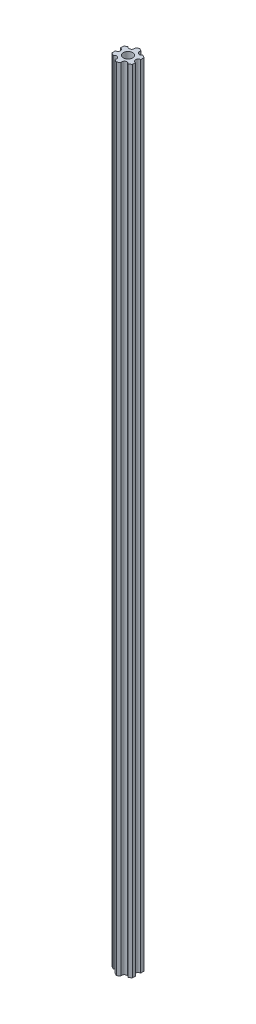
ISO-10303-21;
HEADER;
FILE_DESCRIPTION(('STEP AP214'),'2;1');
FILE_NAME('part.step','',(''),(''),'','','');
FILE_SCHEMA(('AUTOMOTIVE_DESIGN { 1 0 10303 214 1 1 1 1 }'));
ENDSEC;
DATA;
#1=APPLICATION_CONTEXT('core data for automotive mechanical design processes');
#2=APPLICATION_PROTOCOL_DEFINITION('international standard','automotive_design',2000,#1);
#3=PRODUCT_CONTEXT('',#1,'mechanical');
#4=PRODUCT('Part','Part','',(#3));
#5=PRODUCT_RELATED_PRODUCT_CATEGORY('part','',(#4));
#6=PRODUCT_DEFINITION_FORMATION('','',#4);
#7=PRODUCT_DEFINITION_CONTEXT('part definition',#1,'design');
#8=PRODUCT_DEFINITION('design','',#6,#7);
#9=PRODUCT_DEFINITION_SHAPE('','',#8);
#10=(LENGTH_UNIT() NAMED_UNIT(*) SI_UNIT(.MILLI.,.METRE.));
#11=(NAMED_UNIT(*) PLANE_ANGLE_UNIT() SI_UNIT($,.RADIAN.));
#12=(NAMED_UNIT(*) SI_UNIT($,.STERADIAN.) SOLID_ANGLE_UNIT());
#13=UNCERTAINTY_MEASURE_WITH_UNIT(LENGTH_MEASURE(1.E-05),#10,'distance_accuracy_value','');
#14=(GEOMETRIC_REPRESENTATION_CONTEXT(3) GLOBAL_UNCERTAINTY_ASSIGNED_CONTEXT((#13)) GLOBAL_UNIT_ASSIGNED_CONTEXT((#10,
#11,#12)) REPRESENTATION_CONTEXT('',''));
#15=CARTESIAN_POINT('',(0.,0.,0.));
#16=DIRECTION('',(0.,0.,1.));
#17=DIRECTION('',(1.,0.,0.));
#18=AXIS2_PLACEMENT_3D('',#15,#16,#17);
#19=CARTESIAN_POINT('',(3.175,-495.3,5.49926131403119));
#20=DIRECTION('',(0.,1.,0.));
#21=DIRECTION('',(-0.866025403784439,0.,0.5));
#22=AXIS2_PLACEMENT_3D('',#19,#20,#21);
#23=CYLINDRICAL_SURFACE('',#22,1.5875);
#24=DIRECTION('',(0.,-1.,0.));
#25=VECTOR('',#24,1.);
#26=CARTESIAN_POINT('',(1.8001846714922,-495.3,6.29301131403118));
#27=LINE('',#26,#25);
#28=CARTESIAN_POINT('',(1.8001846714922,0.,6.29301131403119));
#29=VERTEX_POINT('',#28);
#30=CARTESIAN_POINT('',(1.8001846714922,-495.3,6.29301131403119));
#31=VERTEX_POINT('',#30);
#32=EDGE_CURVE('E192',#29,#31,#27,.T.);
#33=ORIENTED_EDGE('',*,*,#32,.T.);
#34=CARTESIAN_POINT('',(3.175,-495.3,5.49926131403119));
#35=DIRECTION('',(0.,-1.,0.));
#36=DIRECTION('',(0.866025403784439,0.,-0.5));
#37=AXIS2_PLACEMENT_3D('',#34,#35,#36);
#38=CIRCLE('',#37,1.5875);
#39=CARTESIAN_POINT('',(4.5498153285078,-495.3,4.70551131403118));
#40=VERTEX_POINT('',#39);
#41=EDGE_CURVE('E238',#31,#40,#38,.T.);
#42=ORIENTED_EDGE('',*,*,#41,.T.);
#43=DIRECTION('',(0.,1.,0.));
#44=VECTOR('',#43,1.);
#45=CARTESIAN_POINT('',(4.5498153285078,-495.3,4.70551131403118));
#46=LINE('',#45,#44);
#47=CARTESIAN_POINT('',(4.5498153285078,0.,4.70551131403119));
#48=VERTEX_POINT('',#47);
#49=EDGE_CURVE('E194',#40,#48,#46,.T.);
#50=ORIENTED_EDGE('',*,*,#49,.T.);
#51=CARTESIAN_POINT('',(3.175,0.,5.49926131403119));
#52=DIRECTION('',(0.,-1.,0.));
#53=DIRECTION('',(0.866025403784439,0.,-0.5));
#54=AXIS2_PLACEMENT_3D('',#51,#52,#53);
#55=CIRCLE('',#54,1.5875);
#56=EDGE_CURVE('E189',#29,#48,#55,.T.);
#57=ORIENTED_EDGE('',*,*,#56,.F.);
#58=EDGE_LOOP('',(#33,#42,#50,#57));
#59=FACE_BOUND('',#58,.T.);
#60=ADVANCED_FACE('F17',(#59),#23,.F.);
#61=CARTESIAN_POINT('',(-3.175,-495.3,5.49926131403119));
#62=DIRECTION('',(0.,1.,0.));
#63=DIRECTION('',(-0.866025403784439,0.,-0.5));
#64=AXIS2_PLACEMENT_3D('',#61,#62,#63);
#65=CYLINDRICAL_SURFACE('',#64,1.5875);
#66=DIRECTION('',(0.,-1.,0.));
#67=VECTOR('',#66,1.);
#68=CARTESIAN_POINT('',(-4.5498153285078,-495.3,4.70551131403119));
#69=LINE('',#68,#67);
#70=CARTESIAN_POINT('',(-4.5498153285078,0.,4.70551131403119));
#71=VERTEX_POINT('',#70);
#72=CARTESIAN_POINT('',(-4.5498153285078,-495.3,4.70551131403119));
#73=VERTEX_POINT('',#72);
#74=EDGE_CURVE('E226',#71,#73,#69,.T.);
#75=ORIENTED_EDGE('',*,*,#74,.T.);
#76=CARTESIAN_POINT('',(-3.175,-495.3,5.49926131403119));
#77=DIRECTION('',(0.,-1.,0.));
#78=DIRECTION('',(0.866025403784439,0.,0.5));
#79=AXIS2_PLACEMENT_3D('',#76,#77,#78);
#80=CIRCLE('',#79,1.5875);
#81=CARTESIAN_POINT('',(-1.8001846714922,-495.3,6.29301131403119));
#82=VERTEX_POINT('',#81);
#83=EDGE_CURVE('E387',#73,#82,#80,.T.);
#84=ORIENTED_EDGE('',*,*,#83,.T.);
#85=DIRECTION('',(0.,1.,0.));
#86=VECTOR('',#85,1.);
#87=CARTESIAN_POINT('',(-1.8001846714922,-495.3,6.29301131403119));
#88=LINE('',#87,#86);
#89=CARTESIAN_POINT('',(-1.8001846714922,0.,6.29301131403119));
#90=VERTEX_POINT('',#89);
#91=EDGE_CURVE('E275',#82,#90,#88,.T.);
#92=ORIENTED_EDGE('',*,*,#91,.T.);
#93=CARTESIAN_POINT('',(-3.175,0.,5.49926131403119));
#94=DIRECTION('',(0.,-1.,0.));
#95=DIRECTION('',(0.866025403784439,0.,0.5));
#96=AXIS2_PLACEMENT_3D('',#93,#94,#95);
#97=CIRCLE('',#96,1.5875);
#98=EDGE_CURVE('E11',#71,#90,#97,.T.);
#99=ORIENTED_EDGE('',*,*,#98,.F.);
#100=EDGE_LOOP('',(#75,#84,#92,#99));
#101=FACE_BOUND('',#100,.T.);
#102=ADVANCED_FACE('F430',(#101),#65,.F.);
#103=CARTESIAN_POINT('',(-6.35,-495.3,0.));
#104=DIRECTION('',(0.,1.,0.));
#105=DIRECTION('',(0.,0.,-1.));
#106=AXIS2_PLACEMENT_3D('',#103,#104,#105);
#107=CYLINDRICAL_SURFACE('',#106,1.5875);
#108=DIRECTION('',(0.,-1.,0.));
#109=VECTOR('',#108,1.);
#110=CARTESIAN_POINT('',(-6.35,-495.3,-1.5875));
#111=LINE('',#110,#109);
#112=CARTESIAN_POINT('',(-6.35,0.,-1.5875));
#113=VERTEX_POINT('',#112);
#114=CARTESIAN_POINT('',(-6.35,-495.3,-1.5875));
#115=VERTEX_POINT('',#114);
#116=EDGE_CURVE('E230',#113,#115,#111,.T.);
#117=ORIENTED_EDGE('',*,*,#116,.T.);
#118=CARTESIAN_POINT('',(-6.35,-495.3,0.));
#119=DIRECTION('',(0.,-1.,0.));
#120=DIRECTION('',(0.,0.,1.));
#121=AXIS2_PLACEMENT_3D('',#118,#119,#120);
#122=CIRCLE('',#121,1.5875);
#123=CARTESIAN_POINT('',(-6.35,-495.3,1.5875));
#124=VERTEX_POINT('',#123);
#125=EDGE_CURVE('E390',#115,#124,#122,.T.);
#126=ORIENTED_EDGE('',*,*,#125,.T.);
#127=DIRECTION('',(0.,1.,0.));
#128=VECTOR('',#127,1.);
#129=CARTESIAN_POINT('',(-6.35,-495.3,1.5875));
#130=LINE('',#129,#128);
#131=CARTESIAN_POINT('',(-6.35,0.,1.5875));
#132=VERTEX_POINT('',#131);
#133=EDGE_CURVE('E304',#124,#132,#130,.T.);
#134=ORIENTED_EDGE('',*,*,#133,.T.);
#135=CARTESIAN_POINT('',(-6.35,0.,0.));
#136=DIRECTION('',(0.,-1.,0.));
#137=DIRECTION('',(0.,0.,1.));
#138=AXIS2_PLACEMENT_3D('',#135,#136,#137);
#139=CIRCLE('',#138,1.5875);
#140=EDGE_CURVE('E25',#113,#132,#139,.T.);
#141=ORIENTED_EDGE('',*,*,#140,.F.);
#142=EDGE_LOOP('',(#117,#126,#134,#141));
#143=FACE_BOUND('',#142,.T.);
#144=ADVANCED_FACE('F419',(#143),#107,.F.);
#145=CARTESIAN_POINT('',(-3.175,-495.3,-5.49926131403118));
#146=DIRECTION('',(0.,1.,0.));
#147=DIRECTION('',(0.866025403784439,0.,-0.5));
#148=AXIS2_PLACEMENT_3D('',#145,#146,#147);
#149=CYLINDRICAL_SURFACE('',#148,1.5875);
#150=DIRECTION('',(0.,-1.,0.));
#151=VECTOR('',#150,1.);
#152=CARTESIAN_POINT('',(-1.8001846714922,-495.3,-6.29301131403118));
#153=LINE('',#152,#151);
#154=CARTESIAN_POINT('',(-1.8001846714922,0.,-6.29301131403118));
#155=VERTEX_POINT('',#154);
#156=CARTESIAN_POINT('',(-1.8001846714922,-495.3,-6.29301131403118));
#157=VERTEX_POINT('',#156);
#158=EDGE_CURVE('E316',#155,#157,#153,.T.);
#159=ORIENTED_EDGE('',*,*,#158,.T.);
#160=CARTESIAN_POINT('',(-3.175,-495.3,-5.49926131403118));
#161=DIRECTION('',(0.,-1.,0.));
#162=DIRECTION('',(-0.866025403784439,0.,0.5));
#163=AXIS2_PLACEMENT_3D('',#160,#161,#162);
#164=CIRCLE('',#163,1.5875);
#165=CARTESIAN_POINT('',(-4.5498153285078,-495.3,-4.70551131403118));
#166=VERTEX_POINT('',#165);
#167=EDGE_CURVE('E253',#157,#166,#164,.T.);
#168=ORIENTED_EDGE('',*,*,#167,.T.);
#169=DIRECTION('',(0.,1.,0.));
#170=VECTOR('',#169,1.);
#171=CARTESIAN_POINT('',(-4.5498153285078,-495.3,-4.70551131403118));
#172=LINE('',#171,#170);
#173=CARTESIAN_POINT('',(-4.5498153285078,0.,-4.70551131403118));
#174=VERTEX_POINT('',#173);
#175=EDGE_CURVE('E334',#166,#174,#172,.T.);
#176=ORIENTED_EDGE('',*,*,#175,.T.);
#177=CARTESIAN_POINT('',(-3.175,0.,-5.49926131403118));
#178=DIRECTION('',(0.,-1.,0.));
#179=DIRECTION('',(-0.866025403784439,0.,0.5));
#180=AXIS2_PLACEMENT_3D('',#177,#178,#179);
#181=CIRCLE('',#180,1.5875);
#182=EDGE_CURVE('E221',#155,#174,#181,.T.);
#183=ORIENTED_EDGE('',*,*,#182,.F.);
#184=EDGE_LOOP('',(#159,#168,#176,#183));
#185=FACE_BOUND('',#184,.T.);
#186=ADVANCED_FACE('F409',(#185),#149,.F.);
#187=CARTESIAN_POINT('',(3.175,-495.3,-5.49926131403119));
#188=DIRECTION('',(0.,1.,0.));
#189=DIRECTION('',(0.866025403784439,0.,0.5));
#190=AXIS2_PLACEMENT_3D('',#187,#188,#189);
#191=CYLINDRICAL_SURFACE('',#190,1.5875);
#192=DIRECTION('',(0.,-1.,0.));
#193=VECTOR('',#192,1.);
#194=CARTESIAN_POINT('',(4.5498153285078,-495.3,-4.70551131403119));
#195=LINE('',#194,#193);
#196=CARTESIAN_POINT('',(4.5498153285078,0.,-4.70551131403119));
#197=VERTEX_POINT('',#196);
#198=CARTESIAN_POINT('',(4.5498153285078,-495.3,-4.70551131403119));
#199=VERTEX_POINT('',#198);
#200=EDGE_CURVE('E346',#197,#199,#195,.T.);
#201=ORIENTED_EDGE('',*,*,#200,.T.);
#202=CARTESIAN_POINT('',(3.175,-495.3,-5.49926131403119));
#203=DIRECTION('',(0.,-1.,0.));
#204=DIRECTION('',(-0.866025403784439,0.,-0.5));
#205=AXIS2_PLACEMENT_3D('',#202,#203,#204);
#206=CIRCLE('',#205,1.5875);
#207=CARTESIAN_POINT('',(1.8001846714922,-495.3,-6.29301131403119));
#208=VERTEX_POINT('',#207);
#209=EDGE_CURVE('E249',#199,#208,#206,.T.);
#210=ORIENTED_EDGE('',*,*,#209,.T.);
#211=DIRECTION('',(0.,1.,0.));
#212=VECTOR('',#211,1.);
#213=CARTESIAN_POINT('',(1.8001846714922,-495.3,-6.29301131403119));
#214=LINE('',#213,#212);
#215=CARTESIAN_POINT('',(1.8001846714922,0.,-6.29301131403119));
#216=VERTEX_POINT('',#215);
#217=EDGE_CURVE('E290',#208,#216,#214,.T.);
#218=ORIENTED_EDGE('',*,*,#217,.T.);
#219=CARTESIAN_POINT('',(3.175,0.,-5.49926131403119));
#220=DIRECTION('',(0.,-1.,0.));
#221=DIRECTION('',(-0.866025403784439,0.,-0.5));
#222=AXIS2_PLACEMENT_3D('',#219,#220,#221);
#223=CIRCLE('',#222,1.5875);
#224=EDGE_CURVE('E294',#197,#216,#223,.T.);
#225=ORIENTED_EDGE('',*,*,#224,.F.);
#226=EDGE_LOOP('',(#201,#210,#218,#225));
#227=FACE_BOUND('',#226,.T.);
#228=ADVANCED_FACE('F455',(#227),#191,.F.);
#229=CARTESIAN_POINT('',(6.35,-495.3,0.));
#230=DIRECTION('',(0.,1.,0.));
#231=DIRECTION('',(0.,0.,1.));
#232=AXIS2_PLACEMENT_3D('',#229,#230,#231);
#233=CYLINDRICAL_SURFACE('',#232,1.5875);
#234=DIRECTION('',(0.,-1.,0.));
#235=VECTOR('',#234,1.);
#236=CARTESIAN_POINT('',(6.35,-495.3,1.5875));
#237=LINE('',#236,#235);
#238=CARTESIAN_POINT('',(6.35,0.,1.5875));
#239=VERTEX_POINT('',#238);
#240=CARTESIAN_POINT('',(6.35,-495.3,1.5875));
#241=VERTEX_POINT('',#240);
#242=EDGE_CURVE('E258',#239,#241,#237,.T.);
#243=ORIENTED_EDGE('',*,*,#242,.T.);
#244=CARTESIAN_POINT('',(6.35,-495.3,0.));
#245=DIRECTION('',(0.,-1.,0.));
#246=DIRECTION('',(0.,0.,-1.));
#247=AXIS2_PLACEMENT_3D('',#244,#245,#246);
#248=CIRCLE('',#247,1.5875);
#249=CARTESIAN_POINT('',(6.35,-495.3,-1.5875));
#250=VERTEX_POINT('',#249);
#251=EDGE_CURVE('E252',#241,#250,#248,.T.);
#252=ORIENTED_EDGE('',*,*,#251,.T.);
#253=DIRECTION('',(0.,1.,0.));
#254=VECTOR('',#253,1.);
#255=CARTESIAN_POINT('',(6.35,-495.3,-1.5875));
#256=LINE('',#255,#254);
#257=CARTESIAN_POINT('',(6.35,0.,-1.5875));
#258=VERTEX_POINT('',#257);
#259=EDGE_CURVE('E355',#250,#258,#256,.T.);
#260=ORIENTED_EDGE('',*,*,#259,.T.);
#261=CARTESIAN_POINT('',(6.35,0.,0.));
#262=DIRECTION('',(0.,-1.,0.));
#263=DIRECTION('',(0.,0.,-1.));
#264=AXIS2_PLACEMENT_3D('',#261,#262,#263);
#265=CIRCLE('',#264,1.5875);
#266=EDGE_CURVE('E199',#239,#258,#265,.T.);
#267=ORIENTED_EDGE('',*,*,#266,.F.);
#268=EDGE_LOOP('',(#243,#252,#260,#267));
#269=FACE_BOUND('',#268,.T.);
#270=ADVANCED_FACE('F444',(#269),#233,.F.);
#271=CARTESIAN_POINT('',(0.,-495.3,0.));
#272=DIRECTION('',(0.,1.,0.));
#273=DIRECTION('',(0.,0.,1.));
#274=AXIS2_PLACEMENT_3D('',#271,#272,#273);
#275=CYLINDRICAL_SURFACE('',#274,2.9337);
#276=CARTESIAN_POINT('',(0.,0.,0.));
#277=DIRECTION('',(0.,-1.,0.));
#278=DIRECTION('',(0.,0.,-1.));
#279=AXIS2_PLACEMENT_3D('',#276,#277,#278);
#280=CIRCLE('',#279,2.9337);
#281=CARTESIAN_POINT('',(0.,0.,-2.9337));
#282=VERTEX_POINT('',#281);
#283=EDGE_CURVE('E35',#282,#282,#280,.T.);
#284=ORIENTED_EDGE('',*,*,#283,.F.);
#285=EDGE_LOOP('',(#284));
#286=FACE_BOUND('',#285,.T.);
#287=CARTESIAN_POINT('',(0.,-495.3,0.));
#288=DIRECTION('',(0.,-1.,0.));
#289=DIRECTION('',(0.,0.,-1.));
#290=AXIS2_PLACEMENT_3D('',#287,#288,#289);
#291=CIRCLE('',#290,2.9337);
#292=CARTESIAN_POINT('',(0.,-495.3,-2.9337));
#293=VERTEX_POINT('',#292);
#294=EDGE_CURVE('E42',#293,#293,#291,.T.);
#295=ORIENTED_EDGE('',*,*,#294,.T.);
#296=EDGE_LOOP('',(#295));
#297=FACE_BOUND('',#296,.T.);
#298=ADVANCED_FACE('F488',(#286,#297),#275,.F.);
#299=CARTESIAN_POINT('',(0.,0.,0.));
#300=DIRECTION('',(0.,-1.,0.));
#301=DIRECTION('',(0.,0.,-1.));
#302=AXIS2_PLACEMENT_3D('',#299,#300,#301);
#303=PLANE('',#302);
#304=DIRECTION('',(-0.866025403784439,0.,0.5));
#305=VECTOR('',#304,1.);
#306=CARTESIAN_POINT('',(3.175,0.,5.49926131403118));
#307=LINE('',#306,#305);
#308=CARTESIAN_POINT('',(0.,0.,7.33234841870825));
#309=VERTEX_POINT('',#308);
#310=EDGE_CURVE('E202',#29,#309,#307,.T.);
#311=ORIENTED_EDGE('',*,*,#310,.F.);
#312=ORIENTED_EDGE('',*,*,#56,.T.);
#313=DIRECTION('',(-0.866025403784439,0.,0.5));
#314=VECTOR('',#313,1.);
#315=CARTESIAN_POINT('',(3.175,0.,5.49926131403118));
#316=LINE('',#315,#314);
#317=CARTESIAN_POINT('',(6.35,0.,3.66617420935412));
#318=VERTEX_POINT('',#317);
#319=EDGE_CURVE('E223',#318,#48,#316,.T.);
#320=ORIENTED_EDGE('',*,*,#319,.F.);
#321=DIRECTION('',(0.,0.,1.));
#322=VECTOR('',#321,1.);
#323=CARTESIAN_POINT('',(6.35,0.,0.));
#324=LINE('',#323,#322);
#325=EDGE_CURVE('E377',#239,#318,#324,.T.);
#326=ORIENTED_EDGE('',*,*,#325,.F.);
#327=ORIENTED_EDGE('',*,*,#266,.T.);
#328=DIRECTION('',(0.,0.,1.));
#329=VECTOR('',#328,1.);
#330=CARTESIAN_POINT('',(6.35,0.,0.));
#331=LINE('',#330,#329);
#332=CARTESIAN_POINT('',(6.35,0.,-3.66617420935413));
#333=VERTEX_POINT('',#332);
#334=EDGE_CURVE('E239',#333,#258,#331,.T.);
#335=ORIENTED_EDGE('',*,*,#334,.F.);
#336=DIRECTION('',(0.866025403784439,0.,0.5));
#337=VECTOR('',#336,1.);
#338=CARTESIAN_POINT('',(3.175,0.,-5.49926131403119));
#339=LINE('',#338,#337);
#340=EDGE_CURVE('E350',#197,#333,#339,.T.);
#341=ORIENTED_EDGE('',*,*,#340,.F.);
#342=ORIENTED_EDGE('',*,*,#224,.T.);
#343=DIRECTION('',(0.866025403784439,0.,0.5));
#344=VECTOR('',#343,1.);
#345=CARTESIAN_POINT('',(3.175,0.,-5.49926131403119));
#346=LINE('',#345,#344);
#347=CARTESIAN_POINT('',(0.,0.,-7.33234841870825));
#348=VERTEX_POINT('',#347);
#349=EDGE_CURVE('E254',#348,#216,#346,.T.);
#350=ORIENTED_EDGE('',*,*,#349,.F.);
#351=DIRECTION('',(0.866025403784439,0.,-0.5));
#352=VECTOR('',#351,1.);
#353=CARTESIAN_POINT('',(-3.175,0.,-5.49926131403119));
#354=LINE('',#353,#352);
#355=EDGE_CURVE('E320',#155,#348,#354,.T.);
#356=ORIENTED_EDGE('',*,*,#355,.F.);
#357=ORIENTED_EDGE('',*,*,#182,.T.);
#358=DIRECTION('',(0.866025403784439,0.,-0.5));
#359=VECTOR('',#358,1.);
#360=CARTESIAN_POINT('',(-3.175,0.,-5.49926131403119));
#361=LINE('',#360,#359);
#362=CARTESIAN_POINT('',(-6.35,0.,-3.66617420935412));
#363=VERTEX_POINT('',#362);
#364=EDGE_CURVE('E342',#363,#174,#361,.T.);
#365=ORIENTED_EDGE('',*,*,#364,.F.);
#366=DIRECTION('',(0.,0.,-1.));
#367=VECTOR('',#366,1.);
#368=CARTESIAN_POINT('',(-6.35,0.,0.));
#369=LINE('',#368,#367);
#370=EDGE_CURVE('E276',#113,#363,#369,.T.);
#371=ORIENTED_EDGE('',*,*,#370,.F.);
#372=ORIENTED_EDGE('',*,*,#140,.T.);
#373=DIRECTION('',(0.,0.,-1.));
#374=VECTOR('',#373,1.);
#375=CARTESIAN_POINT('',(-6.35,0.,0.));
#376=LINE('',#375,#374);
#377=CARTESIAN_POINT('',(-6.35,0.,3.66617420935413));
#378=VERTEX_POINT('',#377);
#379=EDGE_CURVE('E312',#378,#132,#376,.T.);
#380=ORIENTED_EDGE('',*,*,#379,.F.);
#381=DIRECTION('',(-0.866025403784439,0.,-0.5));
#382=VECTOR('',#381,1.);
#383=CARTESIAN_POINT('',(-3.175,0.,5.49926131403119));
#384=LINE('',#383,#382);
#385=EDGE_CURVE('E265',#71,#378,#384,.T.);
#386=ORIENTED_EDGE('',*,*,#385,.F.);
#387=ORIENTED_EDGE('',*,*,#98,.T.);
#388=DIRECTION('',(-0.866025403784439,0.,-0.5));
#389=VECTOR('',#388,1.);
#390=CARTESIAN_POINT('',(-3.175,0.,5.49926131403119));
#391=LINE('',#390,#389);
#392=EDGE_CURVE('E205',#309,#90,#391,.T.);
#393=ORIENTED_EDGE('',*,*,#392,.F.);
#394=EDGE_LOOP('',(#311,#312,#320,#326,#327,#335,#341,#342,#350,#356,#357,#365,#371,#372,#380,
#386,#387,#393));
#395=FACE_BOUND('',#394,.T.);
#396=ORIENTED_EDGE('',*,*,#283,.T.);
#397=EDGE_LOOP('',(#396));
#398=FACE_BOUND('',#397,.T.);
#399=ADVANCED_FACE('F203',(#395,#398),#303,.F.);
#400=CARTESIAN_POINT('',(0.,-495.3,0.));
#401=DIRECTION('',(0.,-1.,0.));
#402=DIRECTION('',(0.,0.,-1.));
#403=AXIS2_PLACEMENT_3D('',#400,#401,#402);
#404=PLANE('',#403);
#405=ORIENTED_EDGE('',*,*,#41,.F.);
#406=DIRECTION('',(-0.866025403784439,0.,0.5));
#407=VECTOR('',#406,1.);
#408=CARTESIAN_POINT('',(3.175,-495.3,5.49926131403118));
#409=LINE('',#408,#407);
#410=CARTESIAN_POINT('',(0.,-495.3,7.33234841870825));
#411=VERTEX_POINT('',#410);
#412=EDGE_CURVE('E215',#31,#411,#409,.T.);
#413=ORIENTED_EDGE('',*,*,#412,.T.);
#414=DIRECTION('',(-0.866025403784439,0.,-0.5));
#415=VECTOR('',#414,1.);
#416=CARTESIAN_POINT('',(-3.175,-495.3,5.49926131403119));
#417=LINE('',#416,#415);
#418=EDGE_CURVE('E231',#411,#82,#417,.T.);
#419=ORIENTED_EDGE('',*,*,#418,.T.);
#420=ORIENTED_EDGE('',*,*,#83,.F.);
#421=DIRECTION('',(-0.866025403784439,0.,-0.5));
#422=VECTOR('',#421,1.);
#423=CARTESIAN_POINT('',(-3.175,-495.3,5.49926131403119));
#424=LINE('',#423,#422);
#425=CARTESIAN_POINT('',(-6.35,-495.3,3.66617420935413));
#426=VERTEX_POINT('',#425);
#427=EDGE_CURVE('E264',#73,#426,#424,.T.);
#428=ORIENTED_EDGE('',*,*,#427,.T.);
#429=DIRECTION('',(0.,0.,-1.));
#430=VECTOR('',#429,1.);
#431=CARTESIAN_POINT('',(-6.35,-495.3,0.));
#432=LINE('',#431,#430);
#433=EDGE_CURVE('E308',#426,#124,#432,.T.);
#434=ORIENTED_EDGE('',*,*,#433,.T.);
#435=ORIENTED_EDGE('',*,*,#125,.F.);
#436=DIRECTION('',(0.,0.,-1.));
#437=VECTOR('',#436,1.);
#438=CARTESIAN_POINT('',(-6.35,-495.3,0.));
#439=LINE('',#438,#437);
#440=CARTESIAN_POINT('',(-6.35,-495.3,-3.66617420935412));
#441=VERTEX_POINT('',#440);
#442=EDGE_CURVE('E300',#115,#441,#439,.T.);
#443=ORIENTED_EDGE('',*,*,#442,.T.);
#444=DIRECTION('',(0.866025403784439,0.,-0.5));
#445=VECTOR('',#444,1.);
#446=CARTESIAN_POINT('',(-3.175,-495.3,-5.49926131403119));
#447=LINE('',#446,#445);
#448=EDGE_CURVE('E338',#441,#166,#447,.T.);
#449=ORIENTED_EDGE('',*,*,#448,.T.);
#450=ORIENTED_EDGE('',*,*,#167,.F.);
#451=DIRECTION('',(0.866025403784439,0.,-0.5));
#452=VECTOR('',#451,1.);
#453=CARTESIAN_POINT('',(-3.175,-495.3,-5.49926131403119));
#454=LINE('',#453,#452);
#455=CARTESIAN_POINT('',(0.,-495.3,-7.33234841870825));
#456=VERTEX_POINT('',#455);
#457=EDGE_CURVE('E330',#157,#456,#454,.T.);
#458=ORIENTED_EDGE('',*,*,#457,.T.);
#459=DIRECTION('',(0.866025403784439,0.,0.5));
#460=VECTOR('',#459,1.);
#461=CARTESIAN_POINT('',(3.175,-495.3,-5.49926131403119));
#462=LINE('',#461,#460);
#463=EDGE_CURVE('E259',#456,#208,#462,.T.);
#464=ORIENTED_EDGE('',*,*,#463,.T.);
#465=ORIENTED_EDGE('',*,*,#209,.F.);
#466=DIRECTION('',(0.866025403784439,0.,0.5));
#467=VECTOR('',#466,1.);
#468=CARTESIAN_POINT('',(3.175,-495.3,-5.49926131403119));
#469=LINE('',#468,#467);
#470=CARTESIAN_POINT('',(6.35,-495.3,-3.66617420935413));
#471=VERTEX_POINT('',#470);
#472=EDGE_CURVE('E364',#199,#471,#469,.T.);
#473=ORIENTED_EDGE('',*,*,#472,.T.);
#474=DIRECTION('',(0.,0.,1.));
#475=VECTOR('',#474,1.);
#476=CARTESIAN_POINT('',(6.35,-495.3,0.));
#477=LINE('',#476,#475);
#478=EDGE_CURVE('E359',#471,#250,#477,.T.);
#479=ORIENTED_EDGE('',*,*,#478,.T.);
#480=ORIENTED_EDGE('',*,*,#251,.F.);
#481=DIRECTION('',(0.,0.,1.));
#482=VECTOR('',#481,1.);
#483=CARTESIAN_POINT('',(6.35,-495.3,0.));
#484=LINE('',#483,#482);
#485=CARTESIAN_POINT('',(6.35,-495.3,3.66617420935412));
#486=VERTEX_POINT('',#485);
#487=EDGE_CURVE('E360',#241,#486,#484,.T.);
#488=ORIENTED_EDGE('',*,*,#487,.T.);
#489=DIRECTION('',(-0.866025403784439,0.,0.5));
#490=VECTOR('',#489,1.);
#491=CARTESIAN_POINT('',(3.175,-495.3,5.49926131403118));
#492=LINE('',#491,#490);
#493=EDGE_CURVE('E242',#486,#40,#492,.T.);
#494=ORIENTED_EDGE('',*,*,#493,.T.);
#495=EDGE_LOOP('',(#405,#413,#419,#420,#428,#434,#435,#443,#449,#450,#458,#464,#465,#473,#479,
#480,#488,#494));
#496=FACE_BOUND('',#495,.T.);
#497=ORIENTED_EDGE('',*,*,#294,.F.);
#498=EDGE_LOOP('',(#497));
#499=FACE_BOUND('',#498,.T.);
#500=ADVANCED_FACE('F412',(#496,#499),#404,.T.);
#501=CARTESIAN_POINT('',(6.35,-495.3,0.));
#502=DIRECTION('',(-1.,0.,0.));
#503=DIRECTION('',(0.,1.,0.));
#504=AXIS2_PLACEMENT_3D('',#501,#502,#503);
#505=PLANE('',#504);
#506=ORIENTED_EDGE('',*,*,#259,.F.);
#507=ORIENTED_EDGE('',*,*,#478,.F.);
#508=DIRECTION('',(0.,1.,0.));
#509=VECTOR('',#508,1.);
#510=CARTESIAN_POINT('',(6.35,-495.3,-3.66617420935413));
#511=LINE('',#510,#509);
#512=EDGE_CURVE('E354',#471,#333,#511,.T.);
#513=ORIENTED_EDGE('',*,*,#512,.T.);
#514=ORIENTED_EDGE('',*,*,#334,.T.);
#515=EDGE_LOOP('',(#506,#507,#513,#514));
#516=FACE_BOUND('',#515,.T.);
#517=ADVANCED_FACE('F447',(#516),#505,.F.);
#518=CARTESIAN_POINT('',(6.35,-495.3,0.));
#519=DIRECTION('',(-1.,0.,0.));
#520=DIRECTION('',(0.,1.,0.));
#521=AXIS2_PLACEMENT_3D('',#518,#519,#520);
#522=PLANE('',#521);
#523=ORIENTED_EDGE('',*,*,#242,.F.);
#524=ORIENTED_EDGE('',*,*,#325,.T.);
#525=DIRECTION('',(0.,1.,0.));
#526=VECTOR('',#525,1.);
#527=CARTESIAN_POINT('',(6.35,-495.3,3.66617420935412));
#528=LINE('',#527,#526);
#529=EDGE_CURVE('E227',#486,#318,#528,.T.);
#530=ORIENTED_EDGE('',*,*,#529,.F.);
#531=ORIENTED_EDGE('',*,*,#487,.F.);
#532=EDGE_LOOP('',(#523,#524,#530,#531));
#533=FACE_BOUND('',#532,.T.);
#534=ADVANCED_FACE('F442',(#533),#522,.F.);
#535=CARTESIAN_POINT('',(3.175,-495.3,-5.49926131403119));
#536=DIRECTION('',(-0.5,0.,0.866025403784439));
#537=DIRECTION('',(0.,1.,0.));
#538=AXIS2_PLACEMENT_3D('',#535,#536,#537);
#539=PLANE('',#538);
#540=ORIENTED_EDGE('',*,*,#217,.F.);
#541=ORIENTED_EDGE('',*,*,#463,.F.);
#542=DIRECTION('',(0.,1.,0.));
#543=VECTOR('',#542,1.);
#544=CARTESIAN_POINT('',(0.,-495.3,-7.33234841870825));
#545=LINE('',#544,#543);
#546=EDGE_CURVE('E326',#456,#348,#545,.T.);
#547=ORIENTED_EDGE('',*,*,#546,.T.);
#548=ORIENTED_EDGE('',*,*,#349,.T.);
#549=EDGE_LOOP('',(#540,#541,#547,#548));
#550=FACE_BOUND('',#549,.T.);
#551=ADVANCED_FACE('F458',(#550),#539,.F.);
#552=CARTESIAN_POINT('',(3.175,-495.3,-5.49926131403119));
#553=DIRECTION('',(-0.5,0.,0.866025403784439));
#554=DIRECTION('',(0.,1.,0.));
#555=AXIS2_PLACEMENT_3D('',#552,#553,#554);
#556=PLANE('',#555);
#557=ORIENTED_EDGE('',*,*,#200,.F.);
#558=ORIENTED_EDGE('',*,*,#340,.T.);
#559=ORIENTED_EDGE('',*,*,#512,.F.);
#560=ORIENTED_EDGE('',*,*,#472,.F.);
#561=EDGE_LOOP('',(#557,#558,#559,#560));
#562=FACE_BOUND('',#561,.T.);
#563=ADVANCED_FACE('F453',(#562),#556,.F.);
#564=CARTESIAN_POINT('',(-3.175,-495.3,-5.49926131403119));
#565=DIRECTION('',(0.5,0.,0.866025403784439));
#566=DIRECTION('',(0.,-1.,0.));
#567=AXIS2_PLACEMENT_3D('',#564,#565,#566);
#568=PLANE('',#567);
#569=ORIENTED_EDGE('',*,*,#175,.F.);
#570=ORIENTED_EDGE('',*,*,#448,.F.);
#571=DIRECTION('',(0.,1.,0.));
#572=VECTOR('',#571,1.);
#573=CARTESIAN_POINT('',(-6.35,-495.3,-3.66617420935412));
#574=LINE('',#573,#572);
#575=EDGE_CURVE('E280',#441,#363,#574,.T.);
#576=ORIENTED_EDGE('',*,*,#575,.T.);
#577=ORIENTED_EDGE('',*,*,#364,.T.);
#578=EDGE_LOOP('',(#569,#570,#576,#577));
#579=FACE_BOUND('',#578,.T.);
#580=ADVANCED_FACE('F407',(#579),#568,.F.);
#581=CARTESIAN_POINT('',(-3.175,-495.3,-5.49926131403119));
#582=DIRECTION('',(0.5,0.,0.866025403784439));
#583=DIRECTION('',(0.,-1.,0.));
#584=AXIS2_PLACEMENT_3D('',#581,#582,#583);
#585=PLANE('',#584);
#586=ORIENTED_EDGE('',*,*,#158,.F.);
#587=ORIENTED_EDGE('',*,*,#355,.T.);
#588=ORIENTED_EDGE('',*,*,#546,.F.);
#589=ORIENTED_EDGE('',*,*,#457,.F.);
#590=EDGE_LOOP('',(#586,#587,#588,#589));
#591=FACE_BOUND('',#590,.T.);
#592=ADVANCED_FACE('F461',(#591),#585,.F.);
#593=CARTESIAN_POINT('',(-6.35,-495.3,0.));
#594=DIRECTION('',(1.,0.,0.));
#595=DIRECTION('',(0.,1.,0.));
#596=AXIS2_PLACEMENT_3D('',#593,#594,#595);
#597=PLANE('',#596);
#598=ORIENTED_EDGE('',*,*,#133,.F.);
#599=ORIENTED_EDGE('',*,*,#433,.F.);
#600=DIRECTION('',(0.,1.,0.));
#601=VECTOR('',#600,1.);
#602=CARTESIAN_POINT('',(-6.35,-495.3,3.66617420935413));
#603=LINE('',#602,#601);
#604=EDGE_CURVE('E260',#426,#378,#603,.T.);
#605=ORIENTED_EDGE('',*,*,#604,.T.);
#606=ORIENTED_EDGE('',*,*,#379,.T.);
#607=EDGE_LOOP('',(#598,#599,#605,#606));
#608=FACE_BOUND('',#607,.T.);
#609=ADVANCED_FACE('F422',(#608),#597,.F.);
#610=CARTESIAN_POINT('',(-6.35,-495.3,0.));
#611=DIRECTION('',(1.,0.,0.));
#612=DIRECTION('',(0.,1.,0.));
#613=AXIS2_PLACEMENT_3D('',#610,#611,#612);
#614=PLANE('',#613);
#615=ORIENTED_EDGE('',*,*,#116,.F.);
#616=ORIENTED_EDGE('',*,*,#370,.T.);
#617=ORIENTED_EDGE('',*,*,#575,.F.);
#618=ORIENTED_EDGE('',*,*,#442,.F.);
#619=EDGE_LOOP('',(#615,#616,#617,#618));
#620=FACE_BOUND('',#619,.T.);
#621=ADVANCED_FACE('F417',(#620),#614,.F.);
#622=CARTESIAN_POINT('',(-3.175,-495.3,5.49926131403119));
#623=DIRECTION('',(0.5,0.,-0.866025403784439));
#624=DIRECTION('',(0.,-1.,0.));
#625=AXIS2_PLACEMENT_3D('',#622,#623,#624);
#626=PLANE('',#625);
#627=ORIENTED_EDGE('',*,*,#91,.F.);
#628=ORIENTED_EDGE('',*,*,#418,.F.);
#629=DIRECTION('',(0.,1.,0.));
#630=VECTOR('',#629,1.);
#631=CARTESIAN_POINT('',(0.,-495.3,7.33234841870825));
#632=LINE('',#631,#630);
#633=EDGE_CURVE('E210',#411,#309,#632,.T.);
#634=ORIENTED_EDGE('',*,*,#633,.T.);
#635=ORIENTED_EDGE('',*,*,#392,.T.);
#636=EDGE_LOOP('',(#627,#628,#634,#635));
#637=FACE_BOUND('',#636,.T.);
#638=ADVANCED_FACE('F433',(#637),#626,.F.);
#639=CARTESIAN_POINT('',(-3.175,-495.3,5.49926131403119));
#640=DIRECTION('',(0.5,0.,-0.866025403784439));
#641=DIRECTION('',(0.,-1.,0.));
#642=AXIS2_PLACEMENT_3D('',#639,#640,#641);
#643=PLANE('',#642);
#644=ORIENTED_EDGE('',*,*,#74,.F.);
#645=ORIENTED_EDGE('',*,*,#385,.T.);
#646=ORIENTED_EDGE('',*,*,#604,.F.);
#647=ORIENTED_EDGE('',*,*,#427,.F.);
#648=EDGE_LOOP('',(#644,#645,#646,#647));
#649=FACE_BOUND('',#648,.T.);
#650=ADVANCED_FACE('F428',(#649),#643,.F.);
#651=CARTESIAN_POINT('',(3.175,-495.3,5.49926131403118));
#652=DIRECTION('',(-0.5,0.,-0.866025403784439));
#653=DIRECTION('',(-0.866025403784439,0.,0.5));
#654=AXIS2_PLACEMENT_3D('',#651,#652,#653);
#655=PLANE('',#654);
#656=ORIENTED_EDGE('',*,*,#49,.F.);
#657=ORIENTED_EDGE('',*,*,#493,.F.);
#658=ORIENTED_EDGE('',*,*,#529,.T.);
#659=ORIENTED_EDGE('',*,*,#319,.T.);
#660=EDGE_LOOP('',(#656,#657,#658,#659));
#661=FACE_BOUND('',#660,.T.);
#662=ADVANCED_FACE('F438',(#661),#655,.F.);
#663=CARTESIAN_POINT('',(3.175,-495.3,5.49926131403118));
#664=DIRECTION('',(-0.5,0.,-0.866025403784439));
#665=DIRECTION('',(-0.866025403784439,0.,0.5));
#666=AXIS2_PLACEMENT_3D('',#663,#664,#665);
#667=PLANE('',#666);
#668=ORIENTED_EDGE('',*,*,#32,.F.);
#669=ORIENTED_EDGE('',*,*,#310,.T.);
#670=ORIENTED_EDGE('',*,*,#633,.F.);
#671=ORIENTED_EDGE('',*,*,#412,.F.);
#672=EDGE_LOOP('',(#668,#669,#670,#671));
#673=FACE_BOUND('',#672,.T.);
#674=ADVANCED_FACE('F213',(#673),#667,.F.);
#675=CLOSED_SHELL('',(#60,#102,#144,#186,#228,#270,#298,#399,#500,#517,#534,#551,#563,#580,#592,
#609,#621,#638,#650,#662,#674));
#676=MANIFOLD_SOLID_BREP('B1',#675);
#677=ADVANCED_BREP_SHAPE_REPRESENTATION('',(#18,#676),#14);
#678=SHAPE_DEFINITION_REPRESENTATION(#9,#677);
ENDSEC;
END-ISO-10303-21;
